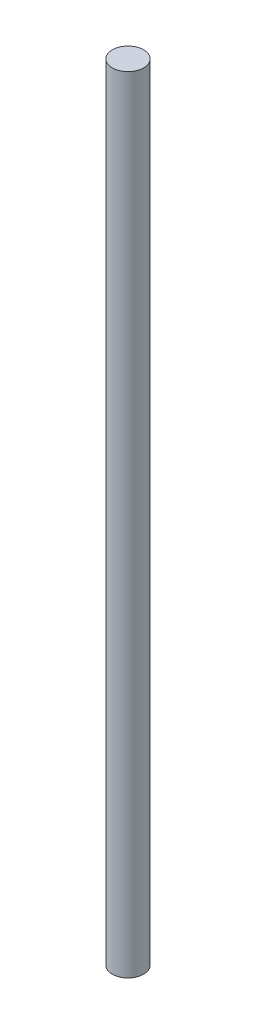
ISO-10303-21;
HEADER;
FILE_DESCRIPTION(('STEP AP214'),'2;1');
FILE_NAME('part.step','',(''),(''),'','','');
FILE_SCHEMA(('AUTOMOTIVE_DESIGN { 1 0 10303 214 1 1 1 1 }'));
ENDSEC;
DATA;
#1=APPLICATION_CONTEXT('core data for automotive mechanical design processes');
#2=APPLICATION_PROTOCOL_DEFINITION('international standard','automotive_design',2000,#1);
#3=PRODUCT_CONTEXT('',#1,'mechanical');
#4=PRODUCT('Part','Part','',(#3));
#5=PRODUCT_RELATED_PRODUCT_CATEGORY('part','',(#4));
#6=PRODUCT_DEFINITION_FORMATION('','',#4);
#7=PRODUCT_DEFINITION_CONTEXT('part definition',#1,'design');
#8=PRODUCT_DEFINITION('design','',#6,#7);
#9=PRODUCT_DEFINITION_SHAPE('','',#8);
#10=(LENGTH_UNIT() NAMED_UNIT(*) SI_UNIT(.MILLI.,.METRE.));
#11=(NAMED_UNIT(*) PLANE_ANGLE_UNIT() SI_UNIT($,.RADIAN.));
#12=(NAMED_UNIT(*) SI_UNIT($,.STERADIAN.) SOLID_ANGLE_UNIT());
#13=UNCERTAINTY_MEASURE_WITH_UNIT(LENGTH_MEASURE(1.E-05),#10,'distance_accuracy_value','');
#14=(GEOMETRIC_REPRESENTATION_CONTEXT(3) GLOBAL_UNCERTAINTY_ASSIGNED_CONTEXT((#13)) GLOBAL_UNIT_ASSIGNED_CONTEXT((#10,
#11,#12)) REPRESENTATION_CONTEXT('',''));
#15=CARTESIAN_POINT('',(0.,0.,0.));
#16=DIRECTION('',(0.,0.,1.));
#17=DIRECTION('',(1.,0.,0.));
#18=AXIS2_PLACEMENT_3D('',#15,#16,#17);
#19=CARTESIAN_POINT('',(0.,100.,0.));
#20=DIRECTION('',(0.,-1.,0.));
#21=DIRECTION('',(0.,0.,-1.));
#22=AXIS2_PLACEMENT_3D('',#19,#20,#21);
#23=CYLINDRICAL_SURFACE('',#22,2.);
#24=CARTESIAN_POINT('',(0.,100.,0.));
#25=DIRECTION('',(0.,1.,0.));
#26=DIRECTION('',(0.,0.,1.));
#27=AXIS2_PLACEMENT_3D('',#24,#25,#26);
#28=CIRCLE('',#27,2.);
#29=CARTESIAN_POINT('',(0.,100.,2.));
#30=VERTEX_POINT('',#29);
#31=EDGE_CURVE('E10',#30,#30,#28,.T.);
#32=ORIENTED_EDGE('',*,*,#31,.F.);
#33=EDGE_LOOP('',(#32));
#34=FACE_BOUND('',#33,.T.);
#35=CARTESIAN_POINT('',(0.,0.,0.));
#36=DIRECTION('',(0.,1.,0.));
#37=DIRECTION('',(0.,0.,1.));
#38=AXIS2_PLACEMENT_3D('',#35,#36,#37);
#39=CIRCLE('',#38,2.);
#40=CARTESIAN_POINT('',(0.,0.,2.));
#41=VERTEX_POINT('',#40);
#42=EDGE_CURVE('E46',#41,#41,#39,.T.);
#43=ORIENTED_EDGE('',*,*,#42,.T.);
#44=EDGE_LOOP('',(#43));
#45=FACE_BOUND('',#44,.T.);
#46=ADVANCED_FACE('F43',(#34,#45),#23,.T.);
#47=CARTESIAN_POINT('',(0.,100.,0.));
#48=DIRECTION('',(0.,1.,0.));
#49=DIRECTION('',(0.,0.,1.));
#50=AXIS2_PLACEMENT_3D('',#47,#48,#49);
#51=PLANE('',#50);
#52=ORIENTED_EDGE('',*,*,#31,.T.);
#53=EDGE_LOOP('',(#52));
#54=FACE_BOUND('',#53,.T.);
#55=ADVANCED_FACE('F60',(#54),#51,.T.);
#56=CARTESIAN_POINT('',(0.,0.,0.));
#57=DIRECTION('',(0.,1.,0.));
#58=DIRECTION('',(0.,0.,1.));
#59=AXIS2_PLACEMENT_3D('',#56,#57,#58);
#60=PLANE('',#59);
#61=ORIENTED_EDGE('',*,*,#42,.F.);
#62=EDGE_LOOP('',(#61));
#63=FACE_BOUND('',#62,.T.);
#64=ADVANCED_FACE('F58',(#63),#60,.F.);
#65=CLOSED_SHELL('',(#46,#55,#64));
#66=MANIFOLD_SOLID_BREP('B2',#65);
#67=ADVANCED_BREP_SHAPE_REPRESENTATION('',(#18,#66),#14);
#68=SHAPE_DEFINITION_REPRESENTATION(#9,#67);
ENDSEC;
END-ISO-10303-21;
